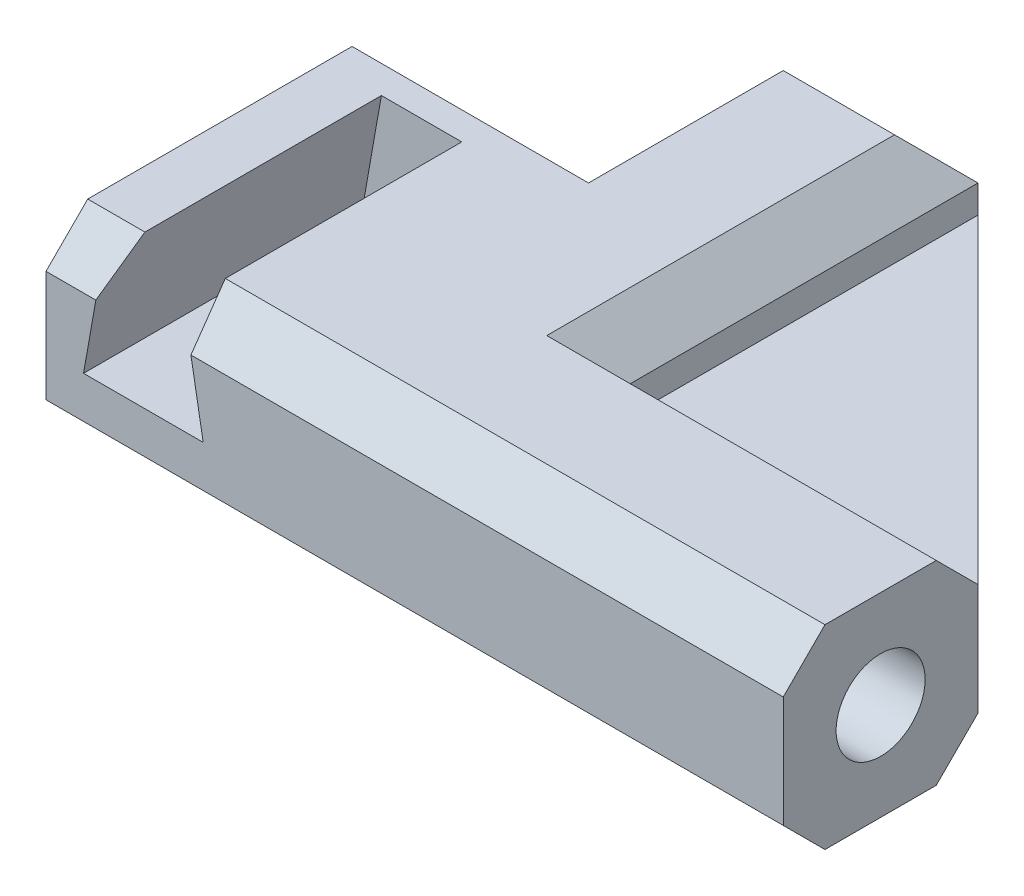
ISO-10303-21;
HEADER;
FILE_DESCRIPTION(('STEP AP214'),'2;1');
FILE_NAME('part.step','',(''),(''),'','','');
FILE_SCHEMA(('AUTOMOTIVE_DESIGN { 1 0 10303 214 1 1 1 1 }'));
ENDSEC;
DATA;
#1=APPLICATION_CONTEXT('core data for automotive mechanical design processes');
#2=APPLICATION_PROTOCOL_DEFINITION('international standard','automotive_design',2000,#1);
#3=PRODUCT_CONTEXT('',#1,'mechanical');
#4=PRODUCT('Part','Part','',(#3));
#5=PRODUCT_RELATED_PRODUCT_CATEGORY('part','',(#4));
#6=PRODUCT_DEFINITION_FORMATION('','',#4);
#7=PRODUCT_DEFINITION_CONTEXT('part definition',#1,'design');
#8=PRODUCT_DEFINITION('design','',#6,#7);
#9=PRODUCT_DEFINITION_SHAPE('','',#8);
#10=(LENGTH_UNIT() NAMED_UNIT(*) SI_UNIT(.MILLI.,.METRE.));
#11=(NAMED_UNIT(*) PLANE_ANGLE_UNIT() SI_UNIT($,.RADIAN.));
#12=(NAMED_UNIT(*) SI_UNIT($,.STERADIAN.) SOLID_ANGLE_UNIT());
#13=UNCERTAINTY_MEASURE_WITH_UNIT(LENGTH_MEASURE(1.E-05),#10,'distance_accuracy_value','');
#14=(GEOMETRIC_REPRESENTATION_CONTEXT(3) GLOBAL_UNCERTAINTY_ASSIGNED_CONTEXT((#13)) GLOBAL_UNIT_ASSIGNED_CONTEXT((#10,
#11,#12)) REPRESENTATION_CONTEXT('',''));
#15=CARTESIAN_POINT('',(0.,0.,0.));
#16=DIRECTION('',(0.,0.,1.));
#17=DIRECTION('',(1.,0.,0.));
#18=AXIS2_PLACEMENT_3D('',#15,#16,#17);
#19=CARTESIAN_POINT('',(-3.5,3.5,-16.));
#20=DIRECTION('',(1.,0.,0.));
#21=DIRECTION('',(0.,0.,-1.));
#22=AXIS2_PLACEMENT_3D('',#19,#20,#21);
#23=PLANE('',#22);
#24=DIRECTION('',(0.,-1.,0.));
#25=VECTOR('',#24,1.);
#26=CARTESIAN_POINT('',(-3.5,3.5,-16.));
#27=LINE('',#26,#25);
#28=CARTESIAN_POINT('',(-3.5,2.,-16.));
#29=VERTEX_POINT('',#28);
#30=CARTESIAN_POINT('',(-3.5,-2.,-16.));
#31=VERTEX_POINT('',#30);
#32=EDGE_CURVE('E323',#29,#31,#27,.T.);
#33=ORIENTED_EDGE('',*,*,#32,.T.);
#34=DIRECTION('',(0.,0.,1.));
#35=VECTOR('',#34,1.);
#36=CARTESIAN_POINT('',(-3.5,-2.,-16.));
#37=LINE('',#36,#35);
#38=CARTESIAN_POINT('',(-3.5,-2.,-7.5));
#39=VERTEX_POINT('',#38);
#40=EDGE_CURVE('E351',#31,#39,#37,.T.);
#41=ORIENTED_EDGE('',*,*,#40,.T.);
#42=DIRECTION('',(0.,-1.,0.));
#43=VECTOR('',#42,1.);
#44=CARTESIAN_POINT('',(-3.5,0.,-7.5));
#45=LINE('',#44,#43);
#46=CARTESIAN_POINT('',(-3.5,2.,-7.5));
#47=VERTEX_POINT('',#46);
#48=EDGE_CURVE('E232',#47,#39,#45,.T.);
#49=ORIENTED_EDGE('',*,*,#48,.F.);
#50=DIRECTION('',(0.,0.,-1.));
#51=VECTOR('',#50,1.);
#52=CARTESIAN_POINT('',(-3.5,2.,-16.));
#53=LINE('',#52,#51);
#54=EDGE_CURVE('E349',#47,#29,#53,.T.);
#55=ORIENTED_EDGE('',*,*,#54,.T.);
#56=EDGE_LOOP('',(#33,#41,#49,#55));
#57=FACE_BOUND('',#56,.T.);
#58=ADVANCED_FACE('F39',(#57),#23,.F.);
#59=CARTESIAN_POINT('',(16.,3.5,-3.5));
#60=DIRECTION('',(0.,0.,1.));
#61=DIRECTION('',(1.,0.,0.));
#62=AXIS2_PLACEMENT_3D('',#59,#60,#61);
#63=PLANE('',#62);
#64=DIRECTION('',(0.,-1.,0.));
#65=VECTOR('',#64,1.);
#66=CARTESIAN_POINT('',(16.,3.5,-3.5));
#67=LINE('',#66,#65);
#68=CARTESIAN_POINT('',(16.,-1.,-3.5));
#69=VERTEX_POINT('',#68);
#70=CARTESIAN_POINT('',(16.,-2.,-3.5));
#71=VERTEX_POINT('',#70);
#72=EDGE_CURVE('E317',#69,#71,#67,.T.);
#73=ORIENTED_EDGE('',*,*,#72,.T.);
#74=DIRECTION('',(-1.,0.,0.));
#75=VECTOR('',#74,1.);
#76=CARTESIAN_POINT('',(16.,-2.,-3.5));
#77=LINE('',#76,#75);
#78=CARTESIAN_POINT('',(3.5,-2.,-3.5));
#79=VERTEX_POINT('',#78);
#80=EDGE_CURVE('E65',#71,#79,#77,.T.);
#81=ORIENTED_EDGE('',*,*,#80,.T.);
#82=DIRECTION('',(0.,-1.,0.));
#83=VECTOR('',#82,1.);
#84=CARTESIAN_POINT('',(3.5,3.5,-3.5));
#85=LINE('',#84,#83);
#86=CARTESIAN_POINT('',(3.5,-1.,-3.5));
#87=VERTEX_POINT('',#86);
#88=EDGE_CURVE('E314',#87,#79,#85,.T.);
#89=ORIENTED_EDGE('',*,*,#88,.F.);
#90=DIRECTION('',(1.,0.,0.));
#91=VECTOR('',#90,1.);
#92=CARTESIAN_POINT('',(16.,-1.,-3.5));
#93=LINE('',#92,#91);
#94=EDGE_CURVE('E282',#87,#69,#93,.T.);
#95=ORIENTED_EDGE('',*,*,#94,.T.);
#96=EDGE_LOOP('',(#73,#81,#89,#95));
#97=FACE_BOUND('',#96,.T.);
#98=ADVANCED_FACE('F467',(#97),#63,.F.);
#99=CARTESIAN_POINT('',(3.5,3.5,-3.5));
#100=DIRECTION('',(-1.,0.,0.));
#101=DIRECTION('',(0.,0.,1.));
#102=AXIS2_PLACEMENT_3D('',#99,#100,#101);
#103=PLANE('',#102);
#104=ORIENTED_EDGE('',*,*,#88,.T.);
#105=DIRECTION('',(0.,0.,-1.));
#106=VECTOR('',#105,1.);
#107=CARTESIAN_POINT('',(3.5,-2.,-3.5));
#108=LINE('',#107,#106);
#109=CARTESIAN_POINT('',(3.5,-2.,-16.));
#110=VERTEX_POINT('',#109);
#111=EDGE_CURVE('E379',#79,#110,#108,.T.);
#112=ORIENTED_EDGE('',*,*,#111,.T.);
#113=DIRECTION('',(0.,-1.,0.));
#114=VECTOR('',#113,1.);
#115=CARTESIAN_POINT('',(3.5,3.5,-16.));
#116=LINE('',#115,#114);
#117=CARTESIAN_POINT('',(3.5,-1.,-16.));
#118=VERTEX_POINT('',#117);
#119=EDGE_CURVE('E306',#118,#110,#116,.T.);
#120=ORIENTED_EDGE('',*,*,#119,.F.);
#121=DIRECTION('',(0.,0.,1.));
#122=VECTOR('',#121,1.);
#123=CARTESIAN_POINT('',(3.5,-1.,-3.5));
#124=LINE('',#123,#122);
#125=EDGE_CURVE('E225',#118,#87,#124,.T.);
#126=ORIENTED_EDGE('',*,*,#125,.T.);
#127=EDGE_LOOP('',(#104,#112,#120,#126));
#128=FACE_BOUND('',#127,.T.);
#129=ADVANCED_FACE('F435',(#128),#103,.F.);
#130=CARTESIAN_POINT('',(3.5,3.5,-16.));
#131=DIRECTION('',(0.,0.,1.));
#132=DIRECTION('',(1.,0.,0.));
#133=AXIS2_PLACEMENT_3D('',#130,#131,#132);
#134=PLANE('',#133);
#135=CARTESIAN_POINT('',(0.,0.,-16.));
#136=DIRECTION('',(0.,0.,-1.));
#137=DIRECTION('',(-1.,0.,0.));
#138=AXIS2_PLACEMENT_3D('',#135,#136,#137);
#139=CIRCLE('',#138,1.6);
#140=CARTESIAN_POINT('',(-1.6,0.,-16.));
#141=VERTEX_POINT('',#140);
#142=EDGE_CURVE('E294',#141,#141,#139,.T.);
#143=ORIENTED_EDGE('',*,*,#142,.F.);
#144=EDGE_LOOP('',(#143));
#145=FACE_BOUND('',#144,.T.);
#146=DIRECTION('',(-1.,0.,0.));
#147=VECTOR('',#146,1.);
#148=CARTESIAN_POINT('',(3.5,-3.5,-16.));
#149=LINE('',#148,#147);
#150=CARTESIAN_POINT('',(2.,-3.5,-16.));
#151=VERTEX_POINT('',#150);
#152=CARTESIAN_POINT('',(-2.,-3.5,-16.));
#153=VERTEX_POINT('',#152);
#154=EDGE_CURVE('E300',#151,#153,#149,.T.);
#155=ORIENTED_EDGE('',*,*,#154,.T.);
#156=DIRECTION('',(0.707106781186548,-0.707106781186547,0.));
#157=VECTOR('',#156,1.);
#158=CARTESIAN_POINT('',(-3.5,-2.,-16.));
#159=LINE('',#158,#157);
#160=EDGE_CURVE('E368',#153,#31,#159,.F.);
#161=ORIENTED_EDGE('',*,*,#160,.T.);
#162=ORIENTED_EDGE('',*,*,#32,.F.);
#163=DIRECTION('',(1.,0.,0.));
#164=VECTOR('',#163,1.);
#165=CARTESIAN_POINT('',(3.5,2.,-16.));
#166=LINE('',#165,#164);
#167=CARTESIAN_POINT('',(3.5,2.,-16.));
#168=VERTEX_POINT('',#167);
#169=EDGE_CURVE('E364',#29,#168,#166,.T.);
#170=ORIENTED_EDGE('',*,*,#169,.T.);
#171=CARTESIAN_POINT('',(3.5,1.,-16.));
#172=VERTEX_POINT('',#171);
#173=EDGE_CURVE('E312',#168,#172,#116,.T.);
#174=ORIENTED_EDGE('',*,*,#173,.T.);
#175=DIRECTION('',(0.,-1.,0.));
#176=VECTOR('',#175,1.);
#177=CARTESIAN_POINT('',(3.5,1.,-16.));
#178=LINE('',#177,#176);
#179=EDGE_CURVE('E280',#172,#118,#178,.T.);
#180=ORIENTED_EDGE('',*,*,#179,.T.);
#181=ORIENTED_EDGE('',*,*,#119,.T.);
#182=DIRECTION('',(0.707106781186548,0.707106781186547,0.));
#183=VECTOR('',#182,1.);
#184=CARTESIAN_POINT('',(3.5,-2.,-16.));
#185=LINE('',#184,#183);
#186=EDGE_CURVE('E366',#110,#151,#185,.F.);
#187=ORIENTED_EDGE('',*,*,#186,.T.);
#188=EDGE_LOOP('',(#155,#161,#162,#170,#174,#180,#181,#187));
#189=FACE_BOUND('',#188,.T.);
#190=ADVANCED_FACE('F433',(#145,#189),#134,.F.);
#191=CARTESIAN_POINT('',(-3.5,3.5,3.5));
#192=DIRECTION('',(0.,0.,-1.));
#193=DIRECTION('',(-1.,0.,0.));
#194=AXIS2_PLACEMENT_3D('',#191,#192,#193);
#195=PLANE('',#194);
#196=DIRECTION('',(-0.173648177666927,-0.984807753012209,0.));
#197=VECTOR('',#196,1.);
#198=CARTESIAN_POINT('',(-8.29559136706887,4.34559214646682,3.5));
#199=LINE('',#198,#197);
#200=CARTESIAN_POINT('',(-8.70918254822885,2.,3.5));
#201=VERTEX_POINT('',#200);
#202=CARTESIAN_POINT('',(-9.15,-0.5,3.5));
#203=VERTEX_POINT('',#202);
#204=EDGE_CURVE('E254',#201,#203,#199,.T.);
#205=ORIENTED_EDGE('',*,*,#204,.F.);
#206=DIRECTION('',(-1.,0.,0.));
#207=VECTOR('',#206,1.);
#208=CARTESIAN_POINT('',(-10.5,2.,3.5));
#209=LINE('',#208,#207);
#210=CARTESIAN_POINT('',(-10.5,2.,3.5));
#211=VERTEX_POINT('',#210);
#212=EDGE_CURVE('E344',#201,#211,#209,.T.);
#213=ORIENTED_EDGE('',*,*,#212,.T.);
#214=DIRECTION('',(0.,1.,0.));
#215=VECTOR('',#214,1.);
#216=CARTESIAN_POINT('',(-10.5,3.5,3.5));
#217=LINE('',#216,#215);
#218=CARTESIAN_POINT('',(-10.5,-2.,3.5));
#219=VERTEX_POINT('',#218);
#220=EDGE_CURVE('E213',#219,#211,#217,.T.);
#221=ORIENTED_EDGE('',*,*,#220,.F.);
#222=DIRECTION('',(1.,0.,0.));
#223=VECTOR('',#222,1.);
#224=CARTESIAN_POINT('',(-3.5,-2.,3.5));
#225=LINE('',#224,#223);
#226=CARTESIAN_POINT('',(16.,-2.,3.5));
#227=VERTEX_POINT('',#226);
#228=EDGE_CURVE('E342',#219,#227,#225,.T.);
#229=ORIENTED_EDGE('',*,*,#228,.T.);
#230=DIRECTION('',(0.,-1.,0.));
#231=VECTOR('',#230,1.);
#232=CARTESIAN_POINT('',(16.,3.5,3.5));
#233=LINE('',#232,#231);
#234=CARTESIAN_POINT('',(16.,2.,3.5));
#235=VERTEX_POINT('',#234);
#236=EDGE_CURVE('E320',#235,#227,#233,.T.);
#237=ORIENTED_EDGE('',*,*,#236,.F.);
#238=DIRECTION('',(-1.,0.,0.));
#239=VECTOR('',#238,1.);
#240=CARTESIAN_POINT('',(-5.55530792283385,2.,3.5));
#241=LINE('',#240,#239);
#242=CARTESIAN_POINT('',(-5.29081745177116,2.,3.5));
#243=VERTEX_POINT('',#242);
#244=EDGE_CURVE('E340',#235,#243,#241,.T.);
#245=ORIENTED_EDGE('',*,*,#244,.T.);
#246=DIRECTION('',(-0.173648177666928,0.984807753012209,0.));
#247=VECTOR('',#246,1.);
#248=CARTESIAN_POINT('',(-5.49333280568182,3.148521644827,3.5));
#249=LINE('',#248,#247);
#250=CARTESIAN_POINT('',(-4.85,-0.5,3.5));
#251=VERTEX_POINT('',#250);
#252=EDGE_CURVE('E246',#251,#243,#249,.T.);
#253=ORIENTED_EDGE('',*,*,#252,.F.);
#254=DIRECTION('',(1.,0.,0.));
#255=VECTOR('',#254,1.);
#256=CARTESIAN_POINT('',(-3.5,-0.5,3.5));
#257=LINE('',#256,#255);
#258=EDGE_CURVE('E256',#203,#251,#257,.T.);
#259=ORIENTED_EDGE('',*,*,#258,.F.);
#260=EDGE_LOOP('',(#205,#213,#221,#229,#237,#245,#253,#259));
#261=FACE_BOUND('',#260,.T.);
#262=ADVANCED_FACE('F477',(#261),#195,.F.);
#263=CARTESIAN_POINT('',(16.,3.5,3.5));
#264=DIRECTION('',(-1.,0.,0.));
#265=DIRECTION('',(0.,0.,1.));
#266=AXIS2_PLACEMENT_3D('',#263,#264,#265);
#267=PLANE('',#266);
#268=CARTESIAN_POINT('',(16.,0.,0.));
#269=DIRECTION('',(1.,0.,0.));
#270=DIRECTION('',(0.,0.,-1.));
#271=AXIS2_PLACEMENT_3D('',#268,#269,#270);
#272=CIRCLE('',#271,1.6);
#273=CARTESIAN_POINT('',(16.,0.,-1.6));
#274=VERTEX_POINT('',#273);
#275=EDGE_CURVE('E290',#274,#274,#272,.T.);
#276=ORIENTED_EDGE('',*,*,#275,.F.);
#277=EDGE_LOOP('',(#276));
#278=FACE_BOUND('',#277,.T.);
#279=ORIENTED_EDGE('',*,*,#236,.T.);
#280=DIRECTION('',(0.,0.707106781186547,0.707106781186548));
#281=VECTOR('',#280,1.);
#282=CARTESIAN_POINT('',(16.,-2.,3.5));
#283=LINE('',#282,#281);
#284=CARTESIAN_POINT('',(16.,-3.5,2.));
#285=VERTEX_POINT('',#284);
#286=EDGE_CURVE('E377',#227,#285,#283,.F.);
#287=ORIENTED_EDGE('',*,*,#286,.T.);
#288=DIRECTION('',(0.,0.,-1.));
#289=VECTOR('',#288,1.);
#290=CARTESIAN_POINT('',(16.,-3.5,3.5));
#291=LINE('',#290,#289);
#292=CARTESIAN_POINT('',(16.,-3.5,-2.));
#293=VERTEX_POINT('',#292);
#294=EDGE_CURVE('E307',#285,#293,#291,.T.);
#295=ORIENTED_EDGE('',*,*,#294,.T.);
#296=DIRECTION('',(0.,-0.707106781186547,0.707106781186548));
#297=VECTOR('',#296,1.);
#298=CARTESIAN_POINT('',(16.,-2.,-3.5));
#299=LINE('',#298,#297);
#300=EDGE_CURVE('E375',#293,#71,#299,.F.);
#301=ORIENTED_EDGE('',*,*,#300,.T.);
#302=ORIENTED_EDGE('',*,*,#72,.F.);
#303=DIRECTION('',(0.,-1.,0.));
#304=VECTOR('',#303,1.);
#305=CARTESIAN_POINT('',(16.,1.,-3.5));
#306=LINE('',#305,#304);
#307=CARTESIAN_POINT('',(16.,1.,-3.5));
#308=VERTEX_POINT('',#307);
#309=EDGE_CURVE('E287',#308,#69,#306,.T.);
#310=ORIENTED_EDGE('',*,*,#309,.F.);
#311=CARTESIAN_POINT('',(16.,2.,-3.5));
#312=VERTEX_POINT('',#311);
#313=EDGE_CURVE('E318',#312,#308,#67,.T.);
#314=ORIENTED_EDGE('',*,*,#313,.F.);
#315=DIRECTION('',(0.,0.707106781186548,0.707106781186547));
#316=VECTOR('',#315,1.);
#317=CARTESIAN_POINT('',(16.,3.5,-2.));
#318=LINE('',#317,#316);
#319=CARTESIAN_POINT('',(16.,3.5,-2.));
#320=VERTEX_POINT('',#319);
#321=EDGE_CURVE('E373',#312,#320,#318,.T.);
#322=ORIENTED_EDGE('',*,*,#321,.T.);
#323=DIRECTION('',(0.,0.,-1.));
#324=VECTOR('',#323,1.);
#325=CARTESIAN_POINT('',(16.,3.5,3.5));
#326=LINE('',#325,#324);
#327=CARTESIAN_POINT('',(16.,3.5,2.));
#328=VERTEX_POINT('',#327);
#329=EDGE_CURVE('E303',#328,#320,#326,.T.);
#330=ORIENTED_EDGE('',*,*,#329,.F.);
#331=DIRECTION('',(0.,-0.707106781186548,0.707106781186547));
#332=VECTOR('',#331,1.);
#333=CARTESIAN_POINT('',(16.,3.5,2.));
#334=LINE('',#333,#332);
#335=EDGE_CURVE('E371',#328,#235,#334,.T.);
#336=ORIENTED_EDGE('',*,*,#335,.T.);
#337=EDGE_LOOP('',(#279,#287,#295,#301,#302,#310,#314,#322,#330,#336));
#338=FACE_BOUND('',#337,.T.);
#339=ADVANCED_FACE('F418',(#278,#338),#267,.F.);
#340=CARTESIAN_POINT('',(3.5,2.,-3.5));
#341=VERTEX_POINT('',#340);
#342=CARTESIAN_POINT('',(3.5,1.,-3.5));
#343=VERTEX_POINT('',#342);
#344=EDGE_CURVE('E315',#341,#343,#85,.T.);
#345=ORIENTED_EDGE('',*,*,#344,.F.);
#346=DIRECTION('',(1.,0.,0.));
#347=VECTOR('',#346,1.);
#348=CARTESIAN_POINT('',(16.,2.,-3.5));
#349=LINE('',#348,#347);
#350=EDGE_CURVE('E384',#341,#312,#349,.T.);
#351=ORIENTED_EDGE('',*,*,#350,.T.);
#352=ORIENTED_EDGE('',*,*,#313,.T.);
#353=DIRECTION('',(1.,0.,0.));
#354=VECTOR('',#353,1.);
#355=CARTESIAN_POINT('',(16.,1.,-3.5));
#356=LINE('',#355,#354);
#357=EDGE_CURVE('E273',#343,#308,#356,.T.);
#358=ORIENTED_EDGE('',*,*,#357,.F.);
#359=EDGE_LOOP('',(#345,#351,#352,#358));
#360=FACE_BOUND('',#359,.T.);
#361=ADVANCED_FACE('F414',(#360),#63,.F.);
#362=ORIENTED_EDGE('',*,*,#173,.F.);
#363=DIRECTION('',(0.,0.,1.));
#364=VECTOR('',#363,1.);
#365=CARTESIAN_POINT('',(3.5,2.,-3.5));
#366=LINE('',#365,#364);
#367=EDGE_CURVE('E57',#168,#341,#366,.T.);
#368=ORIENTED_EDGE('',*,*,#367,.T.);
#369=ORIENTED_EDGE('',*,*,#344,.T.);
#370=DIRECTION('',(0.,0.,1.));
#371=VECTOR('',#370,1.);
#372=CARTESIAN_POINT('',(3.5,1.,-3.5));
#373=LINE('',#372,#371);
#374=EDGE_CURVE('E270',#172,#343,#373,.T.);
#375=ORIENTED_EDGE('',*,*,#374,.F.);
#376=EDGE_LOOP('',(#362,#368,#369,#375));
#377=FACE_BOUND('',#376,.T.);
#378=ADVANCED_FACE('F458',(#377),#103,.F.);
#379=CARTESIAN_POINT('',(0.,3.5,0.));
#380=DIRECTION('',(0.,1.,0.));
#381=DIRECTION('',(0.,0.,1.));
#382=AXIS2_PLACEMENT_3D('',#379,#380,#381);
#383=PLANE('',#382);
#384=DIRECTION('',(0.,0.,1.));
#385=VECTOR('',#384,1.);
#386=CARTESIAN_POINT('',(-10.5,3.50000000000001,-6.5));
#387=LINE('',#386,#385);
#388=CARTESIAN_POINT('',(-10.5,3.50000000000001,-7.5));
#389=VERTEX_POINT('',#388);
#390=CARTESIAN_POINT('',(-10.5,3.50000000000001,2.00000000000001));
#391=VERTEX_POINT('',#390);
#392=EDGE_CURVE('E217',#389,#391,#387,.T.);
#393=ORIENTED_EDGE('',*,*,#392,.T.);
#394=DIRECTION('',(1.,0.,0.));
#395=VECTOR('',#394,1.);
#396=CARTESIAN_POINT('',(-8.44469207716615,3.5,2.00000000000001));
#397=LINE('',#396,#395);
#398=CARTESIAN_POINT('',(-8.44469207716615,3.5,2.00000000000001));
#399=VERTEX_POINT('',#398);
#400=EDGE_CURVE('E336',#391,#399,#397,.T.);
#401=ORIENTED_EDGE('',*,*,#400,.T.);
#402=DIRECTION('',(0.,0.,1.));
#403=VECTOR('',#402,1.);
#404=CARTESIAN_POINT('',(-8.44469207716615,3.5,-6.5));
#405=LINE('',#404,#403);
#406=CARTESIAN_POINT('',(-8.44469207716615,3.5,-6.5));
#407=VERTEX_POINT('',#406);
#408=EDGE_CURVE('E226',#407,#399,#405,.T.);
#409=ORIENTED_EDGE('',*,*,#408,.F.);
#410=DIRECTION('',(1.,0.,0.));
#411=VECTOR('',#410,1.);
#412=CARTESIAN_POINT('',(0.,3.5,-6.5));
#413=LINE('',#412,#411);
#414=CARTESIAN_POINT('',(-5.55530792283385,3.5,-6.5));
#415=VERTEX_POINT('',#414);
#416=EDGE_CURVE('E233',#407,#415,#413,.T.);
#417=ORIENTED_EDGE('',*,*,#416,.T.);
#418=DIRECTION('',(0.,0.,1.));
#419=VECTOR('',#418,1.);
#420=CARTESIAN_POINT('',(-5.55530792283385,3.5,-6.5));
#421=LINE('',#420,#419);
#422=CARTESIAN_POINT('',(-5.55530792283385,3.5,2.));
#423=VERTEX_POINT('',#422);
#424=EDGE_CURVE('E252',#415,#423,#421,.T.);
#425=ORIENTED_EDGE('',*,*,#424,.T.);
#426=DIRECTION('',(1.,0.,0.));
#427=VECTOR('',#426,1.);
#428=CARTESIAN_POINT('',(16.,3.5,2.));
#429=LINE('',#428,#427);
#430=EDGE_CURVE('E326',#423,#328,#429,.T.);
#431=ORIENTED_EDGE('',*,*,#430,.T.);
#432=ORIENTED_EDGE('',*,*,#329,.T.);
#433=DIRECTION('',(-1.,0.,0.));
#434=VECTOR('',#433,1.);
#435=CARTESIAN_POINT('',(3.5,3.5,-2.));
#436=LINE('',#435,#434);
#437=CARTESIAN_POINT('',(2.,3.5,-2.));
#438=VERTEX_POINT('',#437);
#439=EDGE_CURVE('E329',#320,#438,#436,.T.);
#440=ORIENTED_EDGE('',*,*,#439,.T.);
#441=DIRECTION('',(0.,0.,-1.));
#442=VECTOR('',#441,1.);
#443=CARTESIAN_POINT('',(2.,3.5,-16.));
#444=LINE('',#443,#442);
#445=CARTESIAN_POINT('',(2.,3.5,-14.5));
#446=VERTEX_POINT('',#445);
#447=EDGE_CURVE('E331',#438,#446,#444,.T.);
#448=ORIENTED_EDGE('',*,*,#447,.T.);
#449=DIRECTION('',(-1.,0.,0.));
#450=VECTOR('',#449,1.);
#451=CARTESIAN_POINT('',(-3.5,3.5,-14.5));
#452=LINE('',#451,#450);
#453=CARTESIAN_POINT('',(-2.,3.5,-14.5));
#454=VERTEX_POINT('',#453);
#455=EDGE_CURVE('E333',#446,#454,#452,.T.);
#456=ORIENTED_EDGE('',*,*,#455,.T.);
#457=DIRECTION('',(0.,0.,1.));
#458=VECTOR('',#457,1.);
#459=CARTESIAN_POINT('',(-2.,3.5,-7.5));
#460=LINE('',#459,#458);
#461=CARTESIAN_POINT('',(-2.,3.5,-7.5));
#462=VERTEX_POINT('',#461);
#463=EDGE_CURVE('E231',#454,#462,#460,.T.);
#464=ORIENTED_EDGE('',*,*,#463,.T.);
#465=DIRECTION('',(1.,0.,0.));
#466=VECTOR('',#465,1.);
#467=CARTESIAN_POINT('',(0.,3.5,-7.5));
#468=LINE('',#467,#466);
#469=EDGE_CURVE('E206',#389,#462,#468,.T.);
#470=ORIENTED_EDGE('',*,*,#469,.F.);
#471=EDGE_LOOP('',(#393,#401,#409,#417,#425,#431,#432,#440,#448,#456,#464,#470));
#472=FACE_BOUND('',#471,.T.);
#473=ADVANCED_FACE('F229',(#472),#383,.T.);
#474=CARTESIAN_POINT('',(0.,-3.5,0.));
#475=DIRECTION('',(0.,1.,0.));
#476=DIRECTION('',(0.,0.,1.));
#477=AXIS2_PLACEMENT_3D('',#474,#475,#476);
#478=PLANE('',#477);
#479=DIRECTION('',(-1.,0.,0.));
#480=VECTOR('',#479,1.);
#481=CARTESIAN_POINT('',(0.,-3.5,-7.5));
#482=LINE('',#481,#480);
#483=CARTESIAN_POINT('',(-2.,-3.5,-7.5));
#484=VERTEX_POINT('',#483);
#485=CARTESIAN_POINT('',(-9.,-3.5,-7.5));
#486=VERTEX_POINT('',#485);
#487=EDGE_CURVE('E214',#484,#486,#482,.T.);
#488=ORIENTED_EDGE('',*,*,#487,.F.);
#489=DIRECTION('',(0.,0.,-1.));
#490=VECTOR('',#489,1.);
#491=CARTESIAN_POINT('',(-2.,-3.5,0.));
#492=LINE('',#491,#490);
#493=EDGE_CURVE('E362',#484,#153,#492,.T.);
#494=ORIENTED_EDGE('',*,*,#493,.T.);
#495=ORIENTED_EDGE('',*,*,#154,.F.);
#496=DIRECTION('',(0.,0.,1.));
#497=VECTOR('',#496,1.);
#498=CARTESIAN_POINT('',(2.,-3.5,0.));
#499=LINE('',#498,#497);
#500=CARTESIAN_POINT('',(2.,-3.5,-2.));
#501=VERTEX_POINT('',#500);
#502=EDGE_CURVE('E356',#151,#501,#499,.T.);
#503=ORIENTED_EDGE('',*,*,#502,.T.);
#504=DIRECTION('',(1.,0.,0.));
#505=VECTOR('',#504,1.);
#506=CARTESIAN_POINT('',(0.,-3.5,-2.));
#507=LINE('',#506,#505);
#508=EDGE_CURVE('E354',#501,#293,#507,.T.);
#509=ORIENTED_EDGE('',*,*,#508,.T.);
#510=ORIENTED_EDGE('',*,*,#294,.F.);
#511=DIRECTION('',(-1.,0.,0.));
#512=VECTOR('',#511,1.);
#513=CARTESIAN_POINT('',(0.,-3.5,2.));
#514=LINE('',#513,#512);
#515=CARTESIAN_POINT('',(-9.,-3.5,2.));
#516=VERTEX_POINT('',#515);
#517=EDGE_CURVE('E358',#285,#516,#514,.T.);
#518=ORIENTED_EDGE('',*,*,#517,.T.);
#519=DIRECTION('',(0.,0.,-1.));
#520=VECTOR('',#519,1.);
#521=CARTESIAN_POINT('',(-9.,-3.5,0.));
#522=LINE('',#521,#520);
#523=EDGE_CURVE('E360',#516,#486,#522,.T.);
#524=ORIENTED_EDGE('',*,*,#523,.T.);
#525=EDGE_LOOP('',(#488,#494,#495,#503,#509,#510,#518,#524));
#526=FACE_BOUND('',#525,.T.);
#527=ADVANCED_FACE('F444',(#526),#478,.F.);
#528=CARTESIAN_POINT('',(0.,0.,-2.));
#529=DIRECTION('',(0.,0.,-1.));
#530=DIRECTION('',(-1.,0.,0.));
#531=AXIS2_PLACEMENT_3D('',#528,#529,#530);
#532=CYLINDRICAL_SURFACE('',#531,1.6);
#533=CARTESIAN_POINT('',(0.,0.,-2.));
#534=DIRECTION('',(0.,0.,-1.));
#535=DIRECTION('',(-1.,0.,0.));
#536=AXIS2_PLACEMENT_3D('',#533,#534,#535);
#537=CIRCLE('',#536,1.6);
#538=CARTESIAN_POINT('',(-1.6,0.,-2.));
#539=VERTEX_POINT('',#538);
#540=EDGE_CURVE('E297',#539,#539,#537,.T.);
#541=ORIENTED_EDGE('',*,*,#540,.F.);
#542=EDGE_LOOP('',(#541));
#543=FACE_BOUND('',#542,.T.);
#544=ORIENTED_EDGE('',*,*,#142,.T.);
#545=EDGE_LOOP('',(#544));
#546=FACE_BOUND('',#545,.T.);
#547=ADVANCED_FACE('F660',(#543,#546),#532,.F.);
#548=CARTESIAN_POINT('',(0.,0.,-2.));
#549=DIRECTION('',(0.,0.,-1.));
#550=DIRECTION('',(-1.,0.,0.));
#551=AXIS2_PLACEMENT_3D('',#548,#549,#550);
#552=PLANE('',#551);
#553=ORIENTED_EDGE('',*,*,#540,.T.);
#554=EDGE_LOOP('',(#553));
#555=FACE_BOUND('',#554,.T.);
#556=ADVANCED_FACE('F777',(#555),#552,.T.);
#557=CARTESIAN_POINT('',(2.,0.,0.));
#558=DIRECTION('',(1.,0.,0.));
#559=DIRECTION('',(0.,0.,-1.));
#560=AXIS2_PLACEMENT_3D('',#557,#558,#559);
#561=CYLINDRICAL_SURFACE('',#560,1.6);
#562=CARTESIAN_POINT('',(2.,0.,0.));
#563=DIRECTION('',(1.,0.,0.));
#564=DIRECTION('',(0.,0.,-1.));
#565=AXIS2_PLACEMENT_3D('',#562,#563,#564);
#566=CIRCLE('',#565,1.6);
#567=CARTESIAN_POINT('',(2.,0.,-1.6));
#568=VERTEX_POINT('',#567);
#569=EDGE_CURVE('E291',#568,#568,#566,.T.);
#570=ORIENTED_EDGE('',*,*,#569,.F.);
#571=EDGE_LOOP('',(#570));
#572=FACE_BOUND('',#571,.T.);
#573=ORIENTED_EDGE('',*,*,#275,.T.);
#574=EDGE_LOOP('',(#573));
#575=FACE_BOUND('',#574,.T.);
#576=ADVANCED_FACE('F767',(#572,#575),#561,.F.);
#577=CARTESIAN_POINT('',(2.,0.,0.));
#578=DIRECTION('',(1.,0.,0.));
#579=DIRECTION('',(0.,0.,-1.));
#580=AXIS2_PLACEMENT_3D('',#577,#578,#579);
#581=PLANE('',#580);
#582=ORIENTED_EDGE('',*,*,#569,.T.);
#583=EDGE_LOOP('',(#582));
#584=FACE_BOUND('',#583,.T.);
#585=ADVANCED_FACE('F759',(#584),#581,.T.);
#586=CARTESIAN_POINT('',(3.5,1.,-16.));
#587=DIRECTION('',(-0.707106781186547,0.,0.707106781186547));
#588=DIRECTION('',(0.707106781186548,0.,0.707106781186548));
#589=AXIS2_PLACEMENT_3D('',#586,#587,#588);
#590=PLANE('',#589);
#591=DIRECTION('',(-0.707106781186547,0.,-0.707106781186547));
#592=VECTOR('',#591,1.);
#593=CARTESIAN_POINT('',(3.5,-1.,-16.));
#594=LINE('',#593,#592);
#595=EDGE_CURVE('E274',#69,#118,#594,.T.);
#596=ORIENTED_EDGE('',*,*,#595,.T.);
#597=ORIENTED_EDGE('',*,*,#179,.F.);
#598=DIRECTION('',(-0.707106781186547,0.,-0.707106781186547));
#599=VECTOR('',#598,1.);
#600=CARTESIAN_POINT('',(3.5,1.,-16.));
#601=LINE('',#600,#599);
#602=EDGE_CURVE('E277',#308,#172,#601,.T.);
#603=ORIENTED_EDGE('',*,*,#602,.F.);
#604=ORIENTED_EDGE('',*,*,#309,.T.);
#605=EDGE_LOOP('',(#596,#597,#603,#604));
#606=FACE_BOUND('',#605,.T.);
#607=ADVANCED_FACE('F428',(#606),#590,.F.);
#608=CARTESIAN_POINT('',(0.,1.,0.));
#609=DIRECTION('',(0.,1.,0.));
#610=DIRECTION('',(0.,0.,1.));
#611=AXIS2_PLACEMENT_3D('',#608,#609,#610);
#612=PLANE('',#611);
#613=ORIENTED_EDGE('',*,*,#374,.T.);
#614=ORIENTED_EDGE('',*,*,#357,.T.);
#615=ORIENTED_EDGE('',*,*,#602,.T.);
#616=EDGE_LOOP('',(#613,#614,#615));
#617=FACE_BOUND('',#616,.T.);
#618=ADVANCED_FACE('F425',(#617),#612,.T.);
#619=CARTESIAN_POINT('',(0.,-1.,0.));
#620=DIRECTION('',(0.,1.,0.));
#621=DIRECTION('',(0.,0.,1.));
#622=AXIS2_PLACEMENT_3D('',#619,#620,#621);
#623=PLANE('',#622);
#624=ORIENTED_EDGE('',*,*,#125,.F.);
#625=ORIENTED_EDGE('',*,*,#595,.F.);
#626=ORIENTED_EDGE('',*,*,#94,.F.);
#627=EDGE_LOOP('',(#624,#625,#626));
#628=FACE_BOUND('',#627,.T.);
#629=ADVANCED_FACE('F648',(#628),#623,.F.);
#630=CARTESIAN_POINT('',(-10.5,3.5,-6.5));
#631=DIRECTION('',(1.,0.,0.));
#632=DIRECTION('',(0.,0.,-1.));
#633=AXIS2_PLACEMENT_3D('',#630,#631,#632);
#634=PLANE('',#633);
#635=ORIENTED_EDGE('',*,*,#220,.T.);
#636=DIRECTION('',(0.,0.707106781186548,-0.707106781186547));
#637=VECTOR('',#636,1.);
#638=CARTESIAN_POINT('',(-10.5,3.5,2.00000000000001));
#639=LINE('',#638,#637);
#640=EDGE_CURVE('E221',#211,#391,#639,.T.);
#641=ORIENTED_EDGE('',*,*,#640,.T.);
#642=ORIENTED_EDGE('',*,*,#392,.F.);
#643=DIRECTION('',(0.,1.,0.));
#644=VECTOR('',#643,1.);
#645=CARTESIAN_POINT('',(-10.5,0.,-7.5));
#646=LINE('',#645,#644);
#647=CARTESIAN_POINT('',(-10.5,-2.,-7.5));
#648=VERTEX_POINT('',#647);
#649=EDGE_CURVE('E201',#648,#389,#646,.T.);
#650=ORIENTED_EDGE('',*,*,#649,.F.);
#651=DIRECTION('',(0.,0.,1.));
#652=VECTOR('',#651,1.);
#653=CARTESIAN_POINT('',(-10.5,-2.,-6.5));
#654=LINE('',#653,#652);
#655=EDGE_CURVE('E346',#648,#219,#654,.T.);
#656=ORIENTED_EDGE('',*,*,#655,.T.);
#657=EDGE_LOOP('',(#635,#641,#642,#650,#656));
#658=FACE_BOUND('',#657,.T.);
#659=ADVANCED_FACE('F219',(#658),#634,.F.);
#660=CARTESIAN_POINT('',(-8.29559136706887,4.34559214646682,-6.5));
#661=DIRECTION('',(-0.984807753012208,0.173648177666927,0.));
#662=DIRECTION('',(-0.173648177666927,-0.984807753012209,0.));
#663=AXIS2_PLACEMENT_3D('',#660,#661,#662);
#664=PLANE('',#663);
#665=ORIENTED_EDGE('',*,*,#408,.T.);
#666=DIRECTION('',(-0.123724030206482,-0.701673843159864,0.701673843159863));
#667=VECTOR('',#666,1.);
#668=CARTESIAN_POINT('',(-8.31542380766794,4.23311678665867,1.26688321334133));
#669=LINE('',#668,#667);
#670=EDGE_CURVE('E338',#399,#201,#669,.T.);
#671=ORIENTED_EDGE('',*,*,#670,.T.);
#672=ORIENTED_EDGE('',*,*,#204,.T.);
#673=DIRECTION('',(0.,0.,1.));
#674=VECTOR('',#673,1.);
#675=CARTESIAN_POINT('',(-9.15,-0.5,-6.5));
#676=LINE('',#675,#674);
#677=CARTESIAN_POINT('',(-9.15,-0.5,-6.5));
#678=VERTEX_POINT('',#677);
#679=EDGE_CURVE('E265',#678,#203,#676,.T.);
#680=ORIENTED_EDGE('',*,*,#679,.F.);
#681=DIRECTION('',(-0.173648177666927,-0.984807753012209,0.));
#682=VECTOR('',#681,1.);
#683=CARTESIAN_POINT('',(-8.29559136706887,4.34559214646682,-6.5));
#684=LINE('',#683,#682);
#685=EDGE_CURVE('E242',#407,#678,#684,.T.);
#686=ORIENTED_EDGE('',*,*,#685,.F.);
#687=EDGE_LOOP('',(#665,#671,#672,#680,#686));
#688=FACE_BOUND('',#687,.T.);
#689=ADVANCED_FACE('F633',(#688),#664,.F.);
#690=CARTESIAN_POINT('',(-3.5,-0.5,-6.5));
#691=DIRECTION('',(0.,-1.,0.));
#692=DIRECTION('',(0.,0.,-1.));
#693=AXIS2_PLACEMENT_3D('',#690,#691,#692);
#694=PLANE('',#693);
#695=ORIENTED_EDGE('',*,*,#258,.T.);
#696=DIRECTION('',(0.,0.,1.));
#697=VECTOR('',#696,1.);
#698=CARTESIAN_POINT('',(-4.85,-0.5,-6.5));
#699=LINE('',#698,#697);
#700=CARTESIAN_POINT('',(-4.85,-0.5,-6.5));
#701=VERTEX_POINT('',#700);
#702=EDGE_CURVE('E262',#701,#251,#699,.T.);
#703=ORIENTED_EDGE('',*,*,#702,.F.);
#704=DIRECTION('',(1.,0.,0.));
#705=VECTOR('',#704,1.);
#706=CARTESIAN_POINT('',(-3.5,-0.5,-6.5));
#707=LINE('',#706,#705);
#708=EDGE_CURVE('E245',#678,#701,#707,.T.);
#709=ORIENTED_EDGE('',*,*,#708,.F.);
#710=ORIENTED_EDGE('',*,*,#679,.T.);
#711=EDGE_LOOP('',(#695,#703,#709,#710));
#712=FACE_BOUND('',#711,.T.);
#713=ADVANCED_FACE('F624',(#712),#694,.F.);
#714=CARTESIAN_POINT('',(-5.49333280568182,3.148521644827,-6.5));
#715=DIRECTION('',(0.984807753012209,0.173648177666928,0.));
#716=DIRECTION('',(-0.173648177666928,0.984807753012209,0.));
#717=AXIS2_PLACEMENT_3D('',#714,#715,#716);
#718=PLANE('',#717);
#719=ORIENTED_EDGE('',*,*,#252,.T.);
#720=DIRECTION('',(-0.123724030206482,0.701673843159864,-0.701673843159863));
#721=VECTOR('',#720,1.);
#722=CARTESIAN_POINT('',(-5.47026929322458,3.01772196593175,2.48227803406825));
#723=LINE('',#722,#721);
#724=EDGE_CURVE('E386',#243,#423,#723,.T.);
#725=ORIENTED_EDGE('',*,*,#724,.T.);
#726=ORIENTED_EDGE('',*,*,#424,.F.);
#727=DIRECTION('',(-0.173648177666928,0.984807753012209,0.));
#728=VECTOR('',#727,1.);
#729=CARTESIAN_POINT('',(-5.49333280568182,3.148521644827,-6.5));
#730=LINE('',#729,#728);
#731=EDGE_CURVE('E249',#701,#415,#730,.T.);
#732=ORIENTED_EDGE('',*,*,#731,.F.);
#733=ORIENTED_EDGE('',*,*,#702,.T.);
#734=EDGE_LOOP('',(#719,#725,#726,#732,#733));
#735=FACE_BOUND('',#734,.T.);
#736=ADVANCED_FACE('F619',(#735),#718,.F.);
#737=CARTESIAN_POINT('',(0.,0.,-6.5));
#738=DIRECTION('',(0.,0.,-1.));
#739=DIRECTION('',(-1.,0.,0.));
#740=AXIS2_PLACEMENT_3D('',#737,#738,#739);
#741=PLANE('',#740);
#742=ORIENTED_EDGE('',*,*,#416,.F.);
#743=ORIENTED_EDGE('',*,*,#685,.T.);
#744=ORIENTED_EDGE('',*,*,#708,.T.);
#745=ORIENTED_EDGE('',*,*,#731,.T.);
#746=EDGE_LOOP('',(#742,#743,#744,#745));
#747=FACE_BOUND('',#746,.T.);
#748=ADVANCED_FACE('F610',(#747),#741,.F.);
#749=CARTESIAN_POINT('',(0.,0.,-7.5));
#750=DIRECTION('',(0.,0.,-1.));
#751=DIRECTION('',(-1.,0.,0.));
#752=AXIS2_PLACEMENT_3D('',#749,#750,#751);
#753=PLANE('',#752);
#754=ORIENTED_EDGE('',*,*,#487,.T.);
#755=DIRECTION('',(0.707106781186548,-0.707106781186547,0.));
#756=VECTOR('',#755,1.);
#757=CARTESIAN_POINT('',(-6.24999999999999,-6.25,-7.5));
#758=LINE('',#757,#756);
#759=EDGE_CURVE('E209',#486,#648,#758,.F.);
#760=ORIENTED_EDGE('',*,*,#759,.T.);
#761=ORIENTED_EDGE('',*,*,#649,.T.);
#762=ORIENTED_EDGE('',*,*,#469,.T.);
#763=DIRECTION('',(-0.707106781186547,-0.707106781186548,0.));
#764=VECTOR('',#763,1.);
#765=CARTESIAN_POINT('',(-2.,3.5,-7.5));
#766=LINE('',#765,#764);
#767=EDGE_CURVE('E11',#462,#47,#766,.T.);
#768=ORIENTED_EDGE('',*,*,#767,.T.);
#769=ORIENTED_EDGE('',*,*,#48,.T.);
#770=DIRECTION('',(-0.707106781186548,0.707106781186547,0.));
#771=VECTOR('',#770,1.);
#772=CARTESIAN_POINT('',(-3.5,-2.,-7.5));
#773=LINE('',#772,#771);
#774=EDGE_CURVE('E49',#39,#484,#773,.F.);
#775=ORIENTED_EDGE('',*,*,#774,.T.);
#776=EDGE_LOOP('',(#754,#760,#761,#762,#768,#769,#775));
#777=FACE_BOUND('',#776,.T.);
#778=ADVANCED_FACE('F204',(#777),#753,.T.);
#779=CARTESIAN_POINT('',(0.,3.5,2.00000000000001));
#780=DIRECTION('',(0.,0.707106781186547,0.707106781186548));
#781=DIRECTION('',(-1.,0.,0.));
#782=AXIS2_PLACEMENT_3D('',#779,#780,#781);
#783=PLANE('',#782);
#784=ORIENTED_EDGE('',*,*,#640,.F.);
#785=ORIENTED_EDGE('',*,*,#212,.F.);
#786=ORIENTED_EDGE('',*,*,#670,.F.);
#787=ORIENTED_EDGE('',*,*,#400,.F.);
#788=EDGE_LOOP('',(#784,#785,#786,#787));
#789=FACE_BOUND('',#788,.T.);
#790=ADVANCED_FACE('F483',(#789),#783,.T.);
#791=CARTESIAN_POINT('',(-3.5,-2.,-16.));
#792=DIRECTION('',(0.707106781186547,0.707106781186548,0.));
#793=DIRECTION('',(0.,0.,1.));
#794=AXIS2_PLACEMENT_3D('',#791,#792,#793);
#795=PLANE('',#794);
#796=ORIENTED_EDGE('',*,*,#160,.F.);
#797=ORIENTED_EDGE('',*,*,#493,.F.);
#798=ORIENTED_EDGE('',*,*,#774,.F.);
#799=ORIENTED_EDGE('',*,*,#40,.F.);
#800=EDGE_LOOP('',(#796,#797,#798,#799));
#801=FACE_BOUND('',#800,.T.);
#802=ADVANCED_FACE('F448',(#801),#795,.F.);
#803=CARTESIAN_POINT('',(-3.5,-2.,3.5));
#804=DIRECTION('',(0.,0.707106781186548,-0.707106781186547));
#805=DIRECTION('',(1.,0.,0.));
#806=AXIS2_PLACEMENT_3D('',#803,#804,#805);
#807=PLANE('',#806);
#808=ORIENTED_EDGE('',*,*,#286,.F.);
#809=ORIENTED_EDGE('',*,*,#228,.F.);
#810=DIRECTION('',(0.577350269189626,-0.577350269189625,-0.577350269189626));
#811=VECTOR('',#810,1.);
#812=CARTESIAN_POINT('',(-8.16666666666666,-4.33333333333333,1.16666666666666));
#813=LINE('',#812,#811);
#814=EDGE_CURVE('E238',#516,#219,#813,.F.);
#815=ORIENTED_EDGE('',*,*,#814,.F.);
#816=ORIENTED_EDGE('',*,*,#517,.F.);
#817=EDGE_LOOP('',(#808,#809,#815,#816));
#818=FACE_BOUND('',#817,.T.);
#819=ADVANCED_FACE('F495',(#818),#807,.F.);
#820=CARTESIAN_POINT('',(-10.5,-2.,-6.5));
#821=DIRECTION('',(0.707106781186547,0.707106781186548,0.));
#822=DIRECTION('',(0.,0.,1.));
#823=AXIS2_PLACEMENT_3D('',#820,#821,#822);
#824=PLANE('',#823);
#825=ORIENTED_EDGE('',*,*,#759,.F.);
#826=ORIENTED_EDGE('',*,*,#523,.F.);
#827=ORIENTED_EDGE('',*,*,#814,.T.);
#828=ORIENTED_EDGE('',*,*,#655,.F.);
#829=EDGE_LOOP('',(#825,#826,#827,#828));
#830=FACE_BOUND('',#829,.T.);
#831=ADVANCED_FACE('F497',(#830),#824,.F.);
#832=CARTESIAN_POINT('',(16.,-2.,-3.5));
#833=DIRECTION('',(0.,0.707106781186548,0.707106781186547));
#834=DIRECTION('',(-1.,0.,0.));
#835=AXIS2_PLACEMENT_3D('',#832,#833,#834);
#836=PLANE('',#835);
#837=ORIENTED_EDGE('',*,*,#300,.F.);
#838=ORIENTED_EDGE('',*,*,#508,.F.);
#839=DIRECTION('',(0.577350269189626,0.577350269189625,-0.577350269189626));
#840=VECTOR('',#839,1.);
#841=CARTESIAN_POINT('',(3.5,-2.,-3.5));
#842=LINE('',#841,#840);
#843=EDGE_CURVE('E391',#79,#501,#842,.F.);
#844=ORIENTED_EDGE('',*,*,#843,.F.);
#845=ORIENTED_EDGE('',*,*,#80,.F.);
#846=EDGE_LOOP('',(#837,#838,#844,#845));
#847=FACE_BOUND('',#846,.T.);
#848=ADVANCED_FACE('F503',(#847),#836,.F.);
#849=CARTESIAN_POINT('',(3.5,-2.,-3.5));
#850=DIRECTION('',(-0.707106781186547,0.707106781186548,0.));
#851=DIRECTION('',(0.,0.,-1.));
#852=AXIS2_PLACEMENT_3D('',#849,#850,#851);
#853=PLANE('',#852);
#854=ORIENTED_EDGE('',*,*,#843,.T.);
#855=ORIENTED_EDGE('',*,*,#502,.F.);
#856=ORIENTED_EDGE('',*,*,#186,.F.);
#857=ORIENTED_EDGE('',*,*,#111,.F.);
#858=EDGE_LOOP('',(#854,#855,#856,#857));
#859=FACE_BOUND('',#858,.T.);
#860=ADVANCED_FACE('F439',(#859),#853,.F.);
#861=CARTESIAN_POINT('',(0.,3.5,-2.));
#862=DIRECTION('',(0.,0.707106781186547,-0.707106781186548));
#863=DIRECTION('',(1.,0.,0.));
#864=AXIS2_PLACEMENT_3D('',#861,#862,#863);
#865=PLANE('',#864);
#866=ORIENTED_EDGE('',*,*,#321,.F.);
#867=ORIENTED_EDGE('',*,*,#350,.F.);
#868=DIRECTION('',(-0.577350269189625,0.577350269189627,0.577350269189625));
#869=VECTOR('',#868,1.);
#870=CARTESIAN_POINT('',(1.33333333333334,4.16666666666667,-1.33333333333334));
#871=LINE('',#870,#869);
#872=EDGE_CURVE('E44',#438,#341,#871,.F.);
#873=ORIENTED_EDGE('',*,*,#872,.F.);
#874=ORIENTED_EDGE('',*,*,#439,.F.);
#875=EDGE_LOOP('',(#866,#867,#873,#874));
#876=FACE_BOUND('',#875,.T.);
#877=ADVANCED_FACE('F411',(#876),#865,.T.);
#878=CARTESIAN_POINT('',(2.,3.5,0.));
#879=DIRECTION('',(0.707106781186549,0.707106781186546,0.));
#880=DIRECTION('',(0.,0.,1.));
#881=AXIS2_PLACEMENT_3D('',#878,#879,#880);
#882=PLANE('',#881);
#883=ORIENTED_EDGE('',*,*,#872,.T.);
#884=ORIENTED_EDGE('',*,*,#367,.F.);
#885=DIRECTION('',(-0.577350269189625,0.577350269189627,0.577350269189625));
#886=VECTOR('',#885,1.);
#887=CARTESIAN_POINT('',(-2.83333333333332,8.33333333333334,-9.66666666666667));
#888=LINE('',#887,#886);
#889=EDGE_CURVE('E396',#446,#168,#888,.F.);
#890=ORIENTED_EDGE('',*,*,#889,.F.);
#891=ORIENTED_EDGE('',*,*,#447,.F.);
#892=EDGE_LOOP('',(#883,#884,#890,#891));
#893=FACE_BOUND('',#892,.T.);
#894=ADVANCED_FACE('F406',(#893),#882,.T.);
#895=CARTESIAN_POINT('',(0.,3.5,-14.5));
#896=DIRECTION('',(0.,0.707106781186547,-0.707106781186548));
#897=DIRECTION('',(1.,0.,0.));
#898=AXIS2_PLACEMENT_3D('',#895,#896,#897);
#899=PLANE('',#898);
#900=ORIENTED_EDGE('',*,*,#889,.T.);
#901=ORIENTED_EDGE('',*,*,#169,.F.);
#902=DIRECTION('',(0.577350269189625,0.577350269189627,0.577350269189625));
#903=VECTOR('',#902,1.);
#904=CARTESIAN_POINT('',(-1.33333333333334,4.16666666666667,-13.8333333333333));
#905=LINE('',#904,#903);
#906=EDGE_CURVE('E394',#454,#29,#905,.F.);
#907=ORIENTED_EDGE('',*,*,#906,.F.);
#908=ORIENTED_EDGE('',*,*,#455,.F.);
#909=EDGE_LOOP('',(#900,#901,#907,#908));
#910=FACE_BOUND('',#909,.T.);
#911=ADVANCED_FACE('F457',(#910),#899,.T.);
#912=CARTESIAN_POINT('',(-2.,3.5,0.));
#913=DIRECTION('',(-0.707106781186548,0.707106781186547,0.));
#914=DIRECTION('',(0.,0.,-1.));
#915=AXIS2_PLACEMENT_3D('',#912,#913,#914);
#916=PLANE('',#915);
#917=ORIENTED_EDGE('',*,*,#906,.T.);
#918=ORIENTED_EDGE('',*,*,#54,.F.);
#919=ORIENTED_EDGE('',*,*,#767,.F.);
#920=ORIENTED_EDGE('',*,*,#463,.F.);
#921=EDGE_LOOP('',(#917,#918,#919,#920));
#922=FACE_BOUND('',#921,.T.);
#923=ADVANCED_FACE('F455',(#922),#916,.T.);
#924=CARTESIAN_POINT('',(0.,3.5,2.));
#925=DIRECTION('',(0.,0.707106781186547,0.707106781186548));
#926=DIRECTION('',(-1.,0.,0.));
#927=AXIS2_PLACEMENT_3D('',#924,#925,#926);
#928=PLANE('',#927);
#929=ORIENTED_EDGE('',*,*,#724,.F.);
#930=ORIENTED_EDGE('',*,*,#244,.F.);
#931=ORIENTED_EDGE('',*,*,#335,.F.);
#932=ORIENTED_EDGE('',*,*,#430,.F.);
#933=EDGE_LOOP('',(#929,#930,#931,#932));
#934=FACE_BOUND('',#933,.T.);
#935=ADVANCED_FACE('F42',(#934),#928,.T.);
#936=CLOSED_SHELL('',(#58,#98,#129,#190,#262,#339,#361,#378,#473,#527,#547,#556,#576,#585,#607,
#618,#629,#659,#689,#713,#736,#748,#778,#790,#802,#819,#831,#848,#860,#877,#894,#911,#923,#935));
#937=MANIFOLD_SOLID_BREP('B2',#936);
#938=ADVANCED_BREP_SHAPE_REPRESENTATION('',(#18,#937),#14);
#939=SHAPE_DEFINITION_REPRESENTATION(#9,#938);
ENDSEC;
END-ISO-10303-21;
